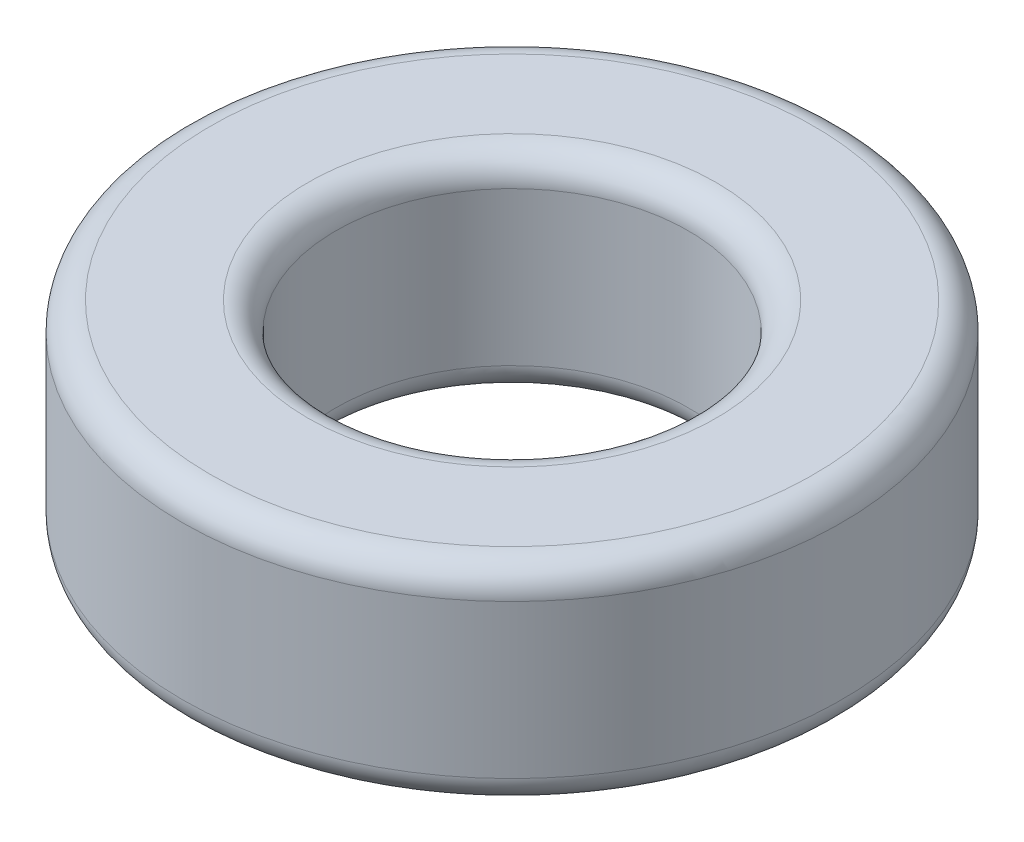
ISO-10303-21;
HEADER;
FILE_DESCRIPTION(('STEP AP214'),'2;1');
FILE_NAME('part.step','',(''),(''),'','','');
FILE_SCHEMA(('AUTOMOTIVE_DESIGN { 1 0 10303 214 1 1 1 1 }'));
ENDSEC;
DATA;
#1=APPLICATION_CONTEXT('core data for automotive mechanical design processes');
#2=APPLICATION_PROTOCOL_DEFINITION('international standard','automotive_design',2000,#1);
#3=PRODUCT_CONTEXT('',#1,'mechanical');
#4=PRODUCT('Part','Part','',(#3));
#5=PRODUCT_RELATED_PRODUCT_CATEGORY('part','',(#4));
#6=PRODUCT_DEFINITION_FORMATION('','',#4);
#7=PRODUCT_DEFINITION_CONTEXT('part definition',#1,'design');
#8=PRODUCT_DEFINITION('design','',#6,#7);
#9=PRODUCT_DEFINITION_SHAPE('','',#8);
#10=(LENGTH_UNIT() NAMED_UNIT(*) SI_UNIT(.MILLI.,.METRE.));
#11=(NAMED_UNIT(*) PLANE_ANGLE_UNIT() SI_UNIT($,.RADIAN.));
#12=(NAMED_UNIT(*) SI_UNIT($,.STERADIAN.) SOLID_ANGLE_UNIT());
#13=UNCERTAINTY_MEASURE_WITH_UNIT(LENGTH_MEASURE(1.E-05),#10,'distance_accuracy_value','');
#14=(GEOMETRIC_REPRESENTATION_CONTEXT(3) GLOBAL_UNCERTAINTY_ASSIGNED_CONTEXT((#13)) GLOBAL_UNIT_ASSIGNED_CONTEXT((#10,
#11,#12)) REPRESENTATION_CONTEXT('',''));
#15=CARTESIAN_POINT('',(0.,0.,0.));
#16=DIRECTION('',(0.,0.,1.));
#17=DIRECTION('',(1.,0.,0.));
#18=AXIS2_PLACEMENT_3D('',#15,#16,#17);
#19=CARTESIAN_POINT('',(0.,15.,0.));
#20=DIRECTION('',(0.,1.,0.));
#21=DIRECTION('',(0.,0.,1.));
#22=AXIS2_PLACEMENT_3D('',#19,#20,#21);
#23=PLANE('',#22);
#24=CARTESIAN_POINT('',(0.,15.,0.));
#25=DIRECTION('',(0.,1.,0.));
#26=DIRECTION('',(0.,0.,1.));
#27=AXIS2_PLACEMENT_3D('',#24,#25,#26);
#28=CIRCLE('',#27,14.65);
#29=CARTESIAN_POINT('',(0.,15.,14.65));
#30=VERTEX_POINT('',#29);
#31=EDGE_CURVE('E50',#30,#30,#28,.F.);
#32=ORIENTED_EDGE('',*,*,#31,.T.);
#33=EDGE_LOOP('',(#32));
#34=FACE_BOUND('',#33,.T.);
#35=CARTESIAN_POINT('',(0.,15.,0.));
#36=DIRECTION('',(0.,1.,0.));
#37=DIRECTION('',(0.,0.,1.));
#38=AXIS2_PLACEMENT_3D('',#35,#36,#37);
#39=CIRCLE('',#38,21.65);
#40=CARTESIAN_POINT('',(0.,15.,21.65));
#41=VERTEX_POINT('',#40);
#42=EDGE_CURVE('E54',#41,#41,#39,.T.);
#43=ORIENTED_EDGE('',*,*,#42,.T.);
#44=EDGE_LOOP('',(#43));
#45=FACE_BOUND('',#44,.T.);
#46=ADVANCED_FACE('F39',(#34,#45),#23,.T.);
#47=CARTESIAN_POINT('',(0.,0.,0.));
#48=DIRECTION('',(0.,1.,0.));
#49=DIRECTION('',(0.,0.,1.));
#50=AXIS2_PLACEMENT_3D('',#47,#48,#49);
#51=PLANE('',#50);
#52=CARTESIAN_POINT('',(0.,0.,0.));
#53=DIRECTION('',(0.,1.,0.));
#54=DIRECTION('',(0.,0.,1.));
#55=AXIS2_PLACEMENT_3D('',#52,#53,#54);
#56=CIRCLE('',#55,14.65);
#57=CARTESIAN_POINT('',(0.,0.,14.65));
#58=VERTEX_POINT('',#57);
#59=EDGE_CURVE('E65',#58,#58,#56,.T.);
#60=ORIENTED_EDGE('',*,*,#59,.T.);
#61=EDGE_LOOP('',(#60));
#62=FACE_BOUND('',#61,.T.);
#63=CARTESIAN_POINT('',(0.,0.,0.));
#64=DIRECTION('',(0.,1.,0.));
#65=DIRECTION('',(0.,0.,1.));
#66=AXIS2_PLACEMENT_3D('',#63,#64,#65);
#67=CIRCLE('',#66,21.65);
#68=CARTESIAN_POINT('',(0.,0.,21.65));
#69=VERTEX_POINT('',#68);
#70=EDGE_CURVE('E68',#69,#69,#67,.F.);
#71=ORIENTED_EDGE('',*,*,#70,.T.);
#72=EDGE_LOOP('',(#71));
#73=FACE_BOUND('',#72,.T.);
#74=ADVANCED_FACE('F72',(#62,#73),#51,.F.);
#75=CARTESIAN_POINT('',(0.,15.,0.));
#76=DIRECTION('',(0.,-1.,0.));
#77=DIRECTION('',(0.,0.,-1.));
#78=AXIS2_PLACEMENT_3D('',#75,#76,#77);
#79=CYLINDRICAL_SURFACE('',#78,23.65);
#80=CARTESIAN_POINT('',(0.,2.,0.));
#81=DIRECTION('',(0.,1.,0.));
#82=DIRECTION('',(0.,0.,1.));
#83=AXIS2_PLACEMENT_3D('',#80,#81,#82);
#84=CIRCLE('',#83,23.65);
#85=CARTESIAN_POINT('',(0.,2.,23.65));
#86=VERTEX_POINT('',#85);
#87=EDGE_CURVE('E10',#86,#86,#84,.T.);
#88=ORIENTED_EDGE('',*,*,#87,.T.);
#89=EDGE_LOOP('',(#88));
#90=FACE_BOUND('',#89,.T.);
#91=CARTESIAN_POINT('',(0.,13.,0.));
#92=DIRECTION('',(0.,1.,0.));
#93=DIRECTION('',(0.,0.,1.));
#94=AXIS2_PLACEMENT_3D('',#91,#92,#93);
#95=CIRCLE('',#94,23.65);
#96=CARTESIAN_POINT('',(0.,13.,23.65));
#97=VERTEX_POINT('',#96);
#98=EDGE_CURVE('E46',#97,#97,#95,.F.);
#99=ORIENTED_EDGE('',*,*,#98,.T.);
#100=EDGE_LOOP('',(#99));
#101=FACE_BOUND('',#100,.T.);
#102=ADVANCED_FACE('F92',(#90,#101),#79,.T.);
#103=CARTESIAN_POINT('',(0.,15.,0.));
#104=DIRECTION('',(0.,-1.,0.));
#105=DIRECTION('',(0.,0.,-1.));
#106=AXIS2_PLACEMENT_3D('',#103,#104,#105);
#107=CYLINDRICAL_SURFACE('',#106,12.65);
#108=CARTESIAN_POINT('',(0.,2.,0.));
#109=DIRECTION('',(0.,1.,0.));
#110=DIRECTION('',(0.,0.,1.));
#111=AXIS2_PLACEMENT_3D('',#108,#109,#110);
#112=CIRCLE('',#111,12.65);
#113=CARTESIAN_POINT('',(0.,2.,12.65));
#114=VERTEX_POINT('',#113);
#115=EDGE_CURVE('E59',#114,#114,#112,.F.);
#116=ORIENTED_EDGE('',*,*,#115,.T.);
#117=EDGE_LOOP('',(#116));
#118=FACE_BOUND('',#117,.T.);
#119=CARTESIAN_POINT('',(0.,13.,0.));
#120=DIRECTION('',(0.,1.,0.));
#121=DIRECTION('',(0.,0.,1.));
#122=AXIS2_PLACEMENT_3D('',#119,#120,#121);
#123=CIRCLE('',#122,12.65);
#124=CARTESIAN_POINT('',(0.,13.,12.65));
#125=VERTEX_POINT('',#124);
#126=EDGE_CURVE('E62',#125,#125,#123,.T.);
#127=ORIENTED_EDGE('',*,*,#126,.T.);
#128=EDGE_LOOP('',(#127));
#129=FACE_BOUND('',#128,.T.);
#130=ADVANCED_FACE('F97',(#118,#129),#107,.F.);
#131=CARTESIAN_POINT('',(0.,2.,0.));
#132=DIRECTION('',(0.,1.,0.));
#133=DIRECTION('',(0.,0.,1.));
#134=AXIS2_PLACEMENT_3D('',#131,#132,#133);
#135=TOROIDAL_SURFACE('',#134,14.65,2.);
#136=ORIENTED_EDGE('',*,*,#115,.F.);
#137=EDGE_LOOP('',(#136));
#138=FACE_BOUND('',#137,.T.);
#139=ORIENTED_EDGE('',*,*,#59,.F.);
#140=EDGE_LOOP('',(#139));
#141=FACE_BOUND('',#140,.T.);
#142=ADVANCED_FACE('F83',(#138,#141),#135,.T.);
#143=CARTESIAN_POINT('',(0.,13.,0.));
#144=DIRECTION('',(0.,1.,0.));
#145=DIRECTION('',(0.,0.,1.));
#146=AXIS2_PLACEMENT_3D('',#143,#144,#145);
#147=TOROIDAL_SURFACE('',#146,14.65,2.);
#148=ORIENTED_EDGE('',*,*,#31,.F.);
#149=EDGE_LOOP('',(#148));
#150=FACE_BOUND('',#149,.T.);
#151=ORIENTED_EDGE('',*,*,#126,.F.);
#152=EDGE_LOOP('',(#151));
#153=FACE_BOUND('',#152,.T.);
#154=ADVANCED_FACE('F77',(#150,#153),#147,.T.);
#155=CARTESIAN_POINT('',(0.,2.,0.));
#156=DIRECTION('',(0.,1.,0.));
#157=DIRECTION('',(0.,0.,1.));
#158=AXIS2_PLACEMENT_3D('',#155,#156,#157);
#159=TOROIDAL_SURFACE('',#158,21.65,2.);
#160=ORIENTED_EDGE('',*,*,#70,.F.);
#161=EDGE_LOOP('',(#160));
#162=FACE_BOUND('',#161,.T.);
#163=ORIENTED_EDGE('',*,*,#87,.F.);
#164=EDGE_LOOP('',(#163));
#165=FACE_BOUND('',#164,.T.);
#166=ADVANCED_FACE('F74',(#162,#165),#159,.T.);
#167=CARTESIAN_POINT('',(0.,13.,0.));
#168=DIRECTION('',(0.,1.,0.));
#169=DIRECTION('',(0.,0.,1.));
#170=AXIS2_PLACEMENT_3D('',#167,#168,#169);
#171=TOROIDAL_SURFACE('',#170,21.65,2.);
#172=ORIENTED_EDGE('',*,*,#98,.F.);
#173=EDGE_LOOP('',(#172));
#174=FACE_BOUND('',#173,.T.);
#175=ORIENTED_EDGE('',*,*,#42,.F.);
#176=EDGE_LOOP('',(#175));
#177=FACE_BOUND('',#176,.T.);
#178=ADVANCED_FACE('F41',(#174,#177),#171,.T.);
#179=CLOSED_SHELL('',(#46,#74,#102,#130,#142,#154,#166,#178));
#180=MANIFOLD_SOLID_BREP('B2',#179);
#181=ADVANCED_BREP_SHAPE_REPRESENTATION('',(#18,#180),#14);
#182=SHAPE_DEFINITION_REPRESENTATION(#9,#181);
ENDSEC;
END-ISO-10303-21;
